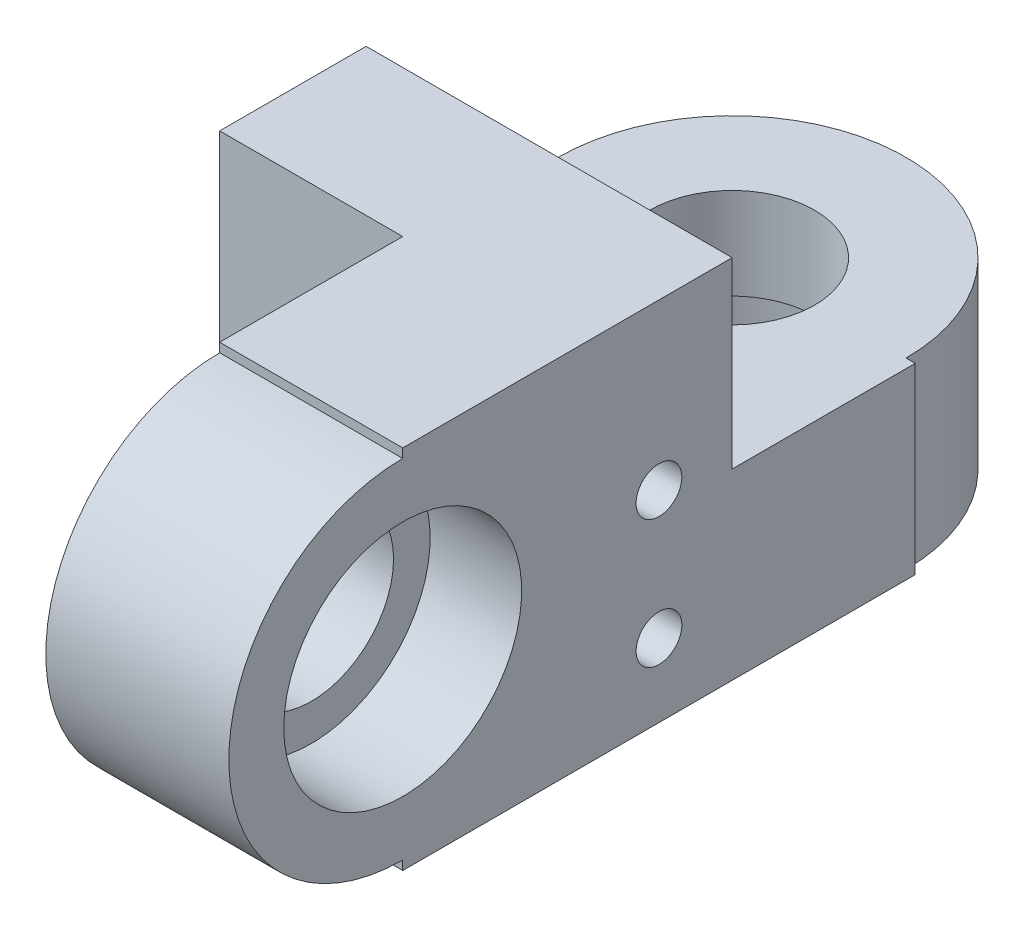
ISO-10303-21;
HEADER;
FILE_DESCRIPTION(('STEP AP214'),'2;1');
FILE_NAME('part.step','',(''),(''),'','','');
FILE_SCHEMA(('AUTOMOTIVE_DESIGN { 1 0 10303 214 1 1 1 1 }'));
ENDSEC;
DATA;
#1=APPLICATION_CONTEXT('core data for automotive mechanical design processes');
#2=APPLICATION_PROTOCOL_DEFINITION('international standard','automotive_design',2000,#1);
#3=PRODUCT_CONTEXT('',#1,'mechanical');
#4=PRODUCT('Part','Part','',(#3));
#5=PRODUCT_RELATED_PRODUCT_CATEGORY('part','',(#4));
#6=PRODUCT_DEFINITION_FORMATION('','',#4);
#7=PRODUCT_DEFINITION_CONTEXT('part definition',#1,'design');
#8=PRODUCT_DEFINITION('design','',#6,#7);
#9=PRODUCT_DEFINITION_SHAPE('','',#8);
#10=(LENGTH_UNIT() NAMED_UNIT(*) SI_UNIT(.MILLI.,.METRE.));
#11=(NAMED_UNIT(*) PLANE_ANGLE_UNIT() SI_UNIT($,.RADIAN.));
#12=(NAMED_UNIT(*) SI_UNIT($,.STERADIAN.) SOLID_ANGLE_UNIT());
#13=UNCERTAINTY_MEASURE_WITH_UNIT(LENGTH_MEASURE(1.E-05),#10,'distance_accuracy_value','');
#14=(GEOMETRIC_REPRESENTATION_CONTEXT(3) GLOBAL_UNCERTAINTY_ASSIGNED_CONTEXT((#13)) GLOBAL_UNIT_ASSIGNED_CONTEXT((#10,
#11,#12)) REPRESENTATION_CONTEXT('',''));
#15=CARTESIAN_POINT('',(0.,0.,0.));
#16=DIRECTION('',(0.,0.,1.));
#17=DIRECTION('',(1.,0.,0.));
#18=AXIS2_PLACEMENT_3D('',#15,#16,#17);
#19=CARTESIAN_POINT('',(10.,10.,50.5344121125077));
#20=DIRECTION('',(-1.,0.,0.));
#21=DIRECTION('',(0.,-1.,0.));
#22=AXIS2_PLACEMENT_3D('',#19,#20,#21);
#23=PLANE('',#22);
#24=CARTESIAN_POINT('',(10.,-5.99999999999996,25.2672060562539));
#25=DIRECTION('',(-1.,0.,0.));
#26=DIRECTION('',(0.,-1.,0.));
#27=AXIS2_PLACEMENT_3D('',#24,#25,#26);
#28=CIRCLE('',#27,1.25);
#29=CARTESIAN_POINT('',(10.,-7.24999999999996,25.2672060562539));
#30=VERTEX_POINT('',#29);
#31=EDGE_CURVE('E216',#30,#30,#28,.T.);
#32=ORIENTED_EDGE('',*,*,#31,.T.);
#33=EDGE_LOOP('',(#32));
#34=FACE_BOUND('',#33,.T.);
#35=CARTESIAN_POINT('',(10.,0.999999999999963,25.2672060562539));
#36=DIRECTION('',(-1.,0.,0.));
#37=DIRECTION('',(0.,-1.,0.));
#38=AXIS2_PLACEMENT_3D('',#35,#36,#37);
#39=CIRCLE('',#38,1.25);
#40=CARTESIAN_POINT('',(10.,-0.250000000000038,25.2672060562539));
#41=VERTEX_POINT('',#40);
#42=EDGE_CURVE('E406',#41,#41,#39,.T.);
#43=ORIENTED_EDGE('',*,*,#42,.T.);
#44=EDGE_LOOP('',(#43));
#45=FACE_BOUND('',#44,.T.);
#46=DIRECTION('',(0.,0.,-1.));
#47=VECTOR('',#46,1.);
#48=CARTESIAN_POINT('',(10.,-10.,50.5344121125077));
#49=LINE('',#48,#47);
#50=CARTESIAN_POINT('',(10.,-9.99999999999996,39.2672060562539));
#51=VERTEX_POINT('',#50);
#52=CARTESIAN_POINT('',(10.,-10.,11.2672060562539));
#53=VERTEX_POINT('',#52);
#54=EDGE_CURVE('E342',#51,#53,#49,.T.);
#55=ORIENTED_EDGE('',*,*,#54,.T.);
#56=DIRECTION('',(0.,1.,0.));
#57=VECTOR('',#56,1.);
#58=CARTESIAN_POINT('',(10.,10.,11.2672060562539));
#59=LINE('',#58,#57);
#60=CARTESIAN_POINT('',(10.,0.,11.2672060562539));
#61=VERTEX_POINT('',#60);
#62=EDGE_CURVE('E320',#53,#61,#59,.T.);
#63=ORIENTED_EDGE('',*,*,#62,.T.);
#64=DIRECTION('',(0.,0.,-1.));
#65=VECTOR('',#64,1.);
#66=CARTESIAN_POINT('',(10.,0.,0.));
#67=LINE('',#66,#65);
#68=CARTESIAN_POINT('',(10.,0.,21.2672060562539));
#69=VERTEX_POINT('',#68);
#70=EDGE_CURVE('E347',#69,#61,#67,.T.);
#71=ORIENTED_EDGE('',*,*,#70,.F.);
#72=DIRECTION('',(0.,-1.,0.));
#73=VECTOR('',#72,1.);
#74=CARTESIAN_POINT('',(10.,10.,21.2672060562539));
#75=LINE('',#74,#73);
#76=CARTESIAN_POINT('',(10.,10.,21.2672060562539));
#77=VERTEX_POINT('',#76);
#78=EDGE_CURVE('E321',#77,#69,#75,.T.);
#79=ORIENTED_EDGE('',*,*,#78,.F.);
#80=DIRECTION('',(0.,0.,-1.));
#81=VECTOR('',#80,1.);
#82=CARTESIAN_POINT('',(10.,10.,50.5344121125077));
#83=LINE('',#82,#81);
#84=CARTESIAN_POINT('',(9.99999999999997,10.,39.2672060562539));
#85=VERTEX_POINT('',#84);
#86=EDGE_CURVE('E336',#85,#77,#83,.T.);
#87=ORIENTED_EDGE('',*,*,#86,.F.);
#88=DIRECTION('',(0.,-1.,0.));
#89=VECTOR('',#88,1.);
#90=CARTESIAN_POINT('',(9.99999999999993,21.2621225064723,39.2672060562539));
#91=LINE('',#90,#89);
#92=CARTESIAN_POINT('',(9.99999999999997,9.50000000000003,39.2672060562539));
#93=VERTEX_POINT('',#92);
#94=EDGE_CURVE('E256',#85,#93,#91,.T.);
#95=ORIENTED_EDGE('',*,*,#94,.T.);
#96=CARTESIAN_POINT('',(10.,0.,39.2672060562539));
#97=DIRECTION('',(-1.,0.,0.));
#98=DIRECTION('',(0.,0.,1.));
#99=AXIS2_PLACEMENT_3D('',#96,#97,#98);
#100=CIRCLE('',#99,9.5);
#101=CARTESIAN_POINT('',(10.,-9.49999999999996,39.2672060562539));
#102=VERTEX_POINT('',#101);
#103=EDGE_CURVE('E248',#102,#93,#100,.T.);
#104=ORIENTED_EDGE('',*,*,#103,.F.);
#105=DIRECTION('',(0.,-1.,0.));
#106=VECTOR('',#105,1.);
#107=CARTESIAN_POINT('',(10.,-9.49999999999996,39.2672060562539));
#108=LINE('',#107,#106);
#109=EDGE_CURVE('E252',#102,#51,#108,.T.);
#110=ORIENTED_EDGE('',*,*,#109,.T.);
#111=EDGE_LOOP('',(#55,#63,#71,#79,#87,#95,#104,#110));
#112=FACE_BOUND('',#111,.T.);
#113=CARTESIAN_POINT('',(10.,0.,39.2672060562539));
#114=DIRECTION('',(-1.,0.,0.));
#115=DIRECTION('',(0.,0.,1.));
#116=AXIS2_PLACEMENT_3D('',#113,#114,#115);
#117=CIRCLE('',#116,6.5);
#118=CARTESIAN_POINT('',(10.,0.,45.7672060562539));
#119=VERTEX_POINT('',#118);
#120=EDGE_CURVE('E234',#119,#119,#117,.T.);
#121=ORIENTED_EDGE('',*,*,#120,.T.);
#122=EDGE_LOOP('',(#121));
#123=FACE_BOUND('',#122,.T.);
#124=ADVANCED_FACE('F69',(#34,#45,#112,#123),#23,.F.);
#125=CARTESIAN_POINT('',(-10.,10.,50.5344121125077));
#126=DIRECTION('',(1.,0.,0.));
#127=DIRECTION('',(0.,1.,0.));
#128=AXIS2_PLACEMENT_3D('',#125,#126,#127);
#129=PLANE('',#128);
#130=CARTESIAN_POINT('',(-9.99999999999999,-5.99999999999996,25.2672060562539));
#131=DIRECTION('',(1.,0.,0.));
#132=DIRECTION('',(0.,1.,0.));
#133=AXIS2_PLACEMENT_3D('',#130,#131,#132);
#134=CIRCLE('',#133,1.25);
#135=CARTESIAN_POINT('',(-9.99999999999999,-4.74999999999996,25.2672060562539));
#136=VERTEX_POINT('',#135);
#137=EDGE_CURVE('E415',#136,#136,#134,.T.);
#138=ORIENTED_EDGE('',*,*,#137,.T.);
#139=EDGE_LOOP('',(#138));
#140=FACE_BOUND('',#139,.T.);
#141=CARTESIAN_POINT('',(-9.99999999999999,0.999999999999963,25.2672060562539));
#142=DIRECTION('',(1.,0.,0.));
#143=DIRECTION('',(0.,1.,0.));
#144=AXIS2_PLACEMENT_3D('',#141,#142,#143);
#145=CIRCLE('',#144,1.25);
#146=CARTESIAN_POINT('',(-9.99999999999999,2.24999999999996,25.2672060562539));
#147=VERTEX_POINT('',#146);
#148=EDGE_CURVE('E400',#147,#147,#145,.T.);
#149=ORIENTED_EDGE('',*,*,#148,.T.);
#150=EDGE_LOOP('',(#149));
#151=FACE_BOUND('',#150,.T.);
#152=DIRECTION('',(0.,0.,-1.));
#153=VECTOR('',#152,1.);
#154=CARTESIAN_POINT('',(-10.,10.,50.5344121125077));
#155=LINE('',#154,#153);
#156=CARTESIAN_POINT('',(-10.,10.,29.2672060562539));
#157=VERTEX_POINT('',#156);
#158=CARTESIAN_POINT('',(-10.,10.,21.2672060562539));
#159=VERTEX_POINT('',#158);
#160=EDGE_CURVE('E385',#157,#159,#155,.T.);
#161=ORIENTED_EDGE('',*,*,#160,.T.);
#162=DIRECTION('',(0.,-1.,0.));
#163=VECTOR('',#162,1.);
#164=CARTESIAN_POINT('',(-10.,10.,21.2672060562539));
#165=LINE('',#164,#163);
#166=CARTESIAN_POINT('',(-10.,0.,21.2672060562539));
#167=VERTEX_POINT('',#166);
#168=EDGE_CURVE('E332',#159,#167,#165,.T.);
#169=ORIENTED_EDGE('',*,*,#168,.T.);
#170=DIRECTION('',(0.,0.,-1.));
#171=VECTOR('',#170,1.);
#172=CARTESIAN_POINT('',(-10.,0.,50.5344121125077));
#173=LINE('',#172,#171);
#174=CARTESIAN_POINT('',(-10.,0.,11.2672060562539));
#175=VERTEX_POINT('',#174);
#176=EDGE_CURVE('E337',#167,#175,#173,.T.);
#177=ORIENTED_EDGE('',*,*,#176,.T.);
#178=DIRECTION('',(0.,-1.,0.));
#179=VECTOR('',#178,1.);
#180=CARTESIAN_POINT('',(-10.,10.,11.2672060562539));
#181=LINE('',#180,#179);
#182=CARTESIAN_POINT('',(-10.,-10.,11.2672060562539));
#183=VERTEX_POINT('',#182);
#184=EDGE_CURVE('E359',#175,#183,#181,.T.);
#185=ORIENTED_EDGE('',*,*,#184,.T.);
#186=DIRECTION('',(0.,0.,-1.));
#187=VECTOR('',#186,1.);
#188=CARTESIAN_POINT('',(-10.,-10.,50.5344121125077));
#189=LINE('',#188,#187);
#190=CARTESIAN_POINT('',(-10.,-10.,29.2672060562539));
#191=VERTEX_POINT('',#190);
#192=EDGE_CURVE('E388',#191,#183,#189,.T.);
#193=ORIENTED_EDGE('',*,*,#192,.F.);
#194=DIRECTION('',(0.,-1.,0.));
#195=VECTOR('',#194,1.);
#196=CARTESIAN_POINT('',(-10.,-10.,29.2672060562539));
#197=LINE('',#196,#195);
#198=EDGE_CURVE('E305',#157,#191,#197,.T.);
#199=ORIENTED_EDGE('',*,*,#198,.F.);
#200=EDGE_LOOP('',(#161,#169,#177,#185,#193,#199));
#201=FACE_BOUND('',#200,.T.);
#202=ADVANCED_FACE('F442',(#140,#151,#201),#129,.F.);
#203=CARTESIAN_POINT('',(-10.,-10.,50.5344121125077));
#204=DIRECTION('',(0.,1.,0.));
#205=DIRECTION('',(0.,0.,1.));
#206=AXIS2_PLACEMENT_3D('',#203,#204,#205);
#207=PLANE('',#206);
#208=DIRECTION('',(-1.,0.,0.));
#209=VECTOR('',#208,1.);
#210=CARTESIAN_POINT('',(-7.,-10.,27.2672060562539));
#211=LINE('',#210,#209);
#212=CARTESIAN_POINT('',(7.,-10.,27.2672060562539));
#213=VERTEX_POINT('',#212);
#214=CARTESIAN_POINT('',(-7.,-10.,27.2672060562539));
#215=VERTEX_POINT('',#214);
#216=EDGE_CURVE('E225',#213,#215,#211,.T.);
#217=ORIENTED_EDGE('',*,*,#216,.F.);
#218=DIRECTION('',(0.,0.,1.));
#219=VECTOR('',#218,1.);
#220=CARTESIAN_POINT('',(7.,-10.,27.2672060562539));
#221=LINE('',#220,#219);
#222=CARTESIAN_POINT('',(7.,-10.,23.2672060562539));
#223=VERTEX_POINT('',#222);
#224=EDGE_CURVE('E87',#223,#213,#221,.T.);
#225=ORIENTED_EDGE('',*,*,#224,.F.);
#226=DIRECTION('',(1.,0.,0.));
#227=VECTOR('',#226,1.);
#228=CARTESIAN_POINT('',(-7.,-10.,23.2672060562539));
#229=LINE('',#228,#227);
#230=CARTESIAN_POINT('',(-7.,-10.,23.2672060562539));
#231=VERTEX_POINT('',#230);
#232=EDGE_CURVE('E209',#231,#223,#229,.T.);
#233=ORIENTED_EDGE('',*,*,#232,.F.);
#234=DIRECTION('',(0.,0.,-1.));
#235=VECTOR('',#234,1.);
#236=CARTESIAN_POINT('',(-7.,-10.,27.2672060562539));
#237=LINE('',#236,#235);
#238=EDGE_CURVE('E213',#215,#231,#237,.T.);
#239=ORIENTED_EDGE('',*,*,#238,.F.);
#240=EDGE_LOOP('',(#217,#225,#233,#239));
#241=FACE_BOUND('',#240,.T.);
#242=ORIENTED_EDGE('',*,*,#192,.T.);
#243=DIRECTION('',(-1.,0.,0.));
#244=VECTOR('',#243,1.);
#245=CARTESIAN_POINT('',(-9.5,-10.,11.2672060562539));
#246=LINE('',#245,#244);
#247=CARTESIAN_POINT('',(-9.5,-10.,11.2672060562539));
#248=VERTEX_POINT('',#247);
#249=EDGE_CURVE('E369',#248,#183,#246,.T.);
#250=ORIENTED_EDGE('',*,*,#249,.F.);
#251=CARTESIAN_POINT('',(0.,-10.,11.2672060562539));
#252=DIRECTION('',(0.,-1.,0.));
#253=DIRECTION('',(0.,0.,-1.));
#254=AXIS2_PLACEMENT_3D('',#251,#252,#253);
#255=CIRCLE('',#254,9.5);
#256=CARTESIAN_POINT('',(9.5,-10.,11.2672060562539));
#257=VERTEX_POINT('',#256);
#258=EDGE_CURVE('E315',#248,#257,#255,.T.);
#259=ORIENTED_EDGE('',*,*,#258,.T.);
#260=DIRECTION('',(-1.,0.,0.));
#261=VECTOR('',#260,1.);
#262=CARTESIAN_POINT('',(21.2621225064723,-10.,11.2672060562539));
#263=LINE('',#262,#261);
#264=EDGE_CURVE('E373',#53,#257,#263,.T.);
#265=ORIENTED_EDGE('',*,*,#264,.F.);
#266=ORIENTED_EDGE('',*,*,#54,.F.);
#267=DIRECTION('',(1.,0.,0.));
#268=VECTOR('',#267,1.);
#269=CARTESIAN_POINT('',(-9.99999999999996,-10.,39.2672060562539));
#270=LINE('',#269,#268);
#271=CARTESIAN_POINT('',(0.,-10.,39.2672060562539));
#272=VERTEX_POINT('',#271);
#273=EDGE_CURVE('E269',#272,#51,#270,.T.);
#274=ORIENTED_EDGE('',*,*,#273,.F.);
#275=DIRECTION('',(0.,0.,1.));
#276=VECTOR('',#275,1.);
#277=CARTESIAN_POINT('',(0.,-10.,50.5344121125077));
#278=LINE('',#277,#276);
#279=CARTESIAN_POINT('',(0.,-10.,29.2672060562539));
#280=VERTEX_POINT('',#279);
#281=EDGE_CURVE('E281',#280,#272,#278,.T.);
#282=ORIENTED_EDGE('',*,*,#281,.F.);
#283=DIRECTION('',(1.,0.,0.));
#284=VECTOR('',#283,1.);
#285=CARTESIAN_POINT('',(-10.,-10.,29.2672060562539));
#286=LINE('',#285,#284);
#287=EDGE_CURVE('E95',#191,#280,#286,.T.);
#288=ORIENTED_EDGE('',*,*,#287,.F.);
#289=EDGE_LOOP('',(#242,#250,#259,#265,#266,#274,#282,#288));
#290=FACE_BOUND('',#289,.T.);
#291=CARTESIAN_POINT('',(0.,-10.,11.2672060562539));
#292=DIRECTION('',(0.,-1.,0.));
#293=DIRECTION('',(0.,0.,-1.));
#294=AXIS2_PLACEMENT_3D('',#291,#292,#293);
#295=CIRCLE('',#294,6.5);
#296=CARTESIAN_POINT('',(0.,-10.,4.76720605625386));
#297=VERTEX_POINT('',#296);
#298=EDGE_CURVE('E13',#297,#297,#295,.T.);
#299=ORIENTED_EDGE('',*,*,#298,.F.);
#300=EDGE_LOOP('',(#299));
#301=FACE_BOUND('',#300,.T.);
#302=ADVANCED_FACE('F71',(#241,#290,#301),#207,.F.);
#303=CARTESIAN_POINT('',(-10.,10.,50.5344121125077));
#304=DIRECTION('',(0.,-1.,0.));
#305=DIRECTION('',(1.,0.,0.));
#306=AXIS2_PLACEMENT_3D('',#303,#304,#305);
#307=PLANE('',#306);
#308=ORIENTED_EDGE('',*,*,#86,.T.);
#309=DIRECTION('',(1.,0.,0.));
#310=VECTOR('',#309,1.);
#311=CARTESIAN_POINT('',(-24.,10.,21.2672060562539));
#312=LINE('',#311,#310);
#313=EDGE_CURVE('E343',#159,#77,#312,.T.);
#314=ORIENTED_EDGE('',*,*,#313,.F.);
#315=ORIENTED_EDGE('',*,*,#160,.F.);
#316=DIRECTION('',(-1.,0.,0.));
#317=VECTOR('',#316,1.);
#318=CARTESIAN_POINT('',(-10.,10.,29.2672060562539));
#319=LINE('',#318,#317);
#320=CARTESIAN_POINT('',(0.,10.,29.2672060562539));
#321=VERTEX_POINT('',#320);
#322=EDGE_CURVE('E296',#321,#157,#319,.T.);
#323=ORIENTED_EDGE('',*,*,#322,.F.);
#324=DIRECTION('',(0.,0.,1.));
#325=VECTOR('',#324,1.);
#326=CARTESIAN_POINT('',(0.,10.,50.5344121125077));
#327=LINE('',#326,#325);
#328=CARTESIAN_POINT('',(0.,10.,39.2672060562539));
#329=VERTEX_POINT('',#328);
#330=EDGE_CURVE('E274',#321,#329,#327,.T.);
#331=ORIENTED_EDGE('',*,*,#330,.T.);
#332=DIRECTION('',(-1.,0.,0.));
#333=VECTOR('',#332,1.);
#334=CARTESIAN_POINT('',(-10.,9.99999999999997,39.2672060562539));
#335=LINE('',#334,#333);
#336=EDGE_CURVE('E266',#85,#329,#335,.T.);
#337=ORIENTED_EDGE('',*,*,#336,.F.);
#338=EDGE_LOOP('',(#308,#314,#315,#323,#331,#337));
#339=FACE_BOUND('',#338,.T.);
#340=ADVANCED_FACE('F449',(#339),#307,.F.);
#341=CARTESIAN_POINT('',(0.,11.,11.2672060562539));
#342=DIRECTION('',(0.,-1.,0.));
#343=DIRECTION('',(0.,0.,-1.));
#344=AXIS2_PLACEMENT_3D('',#341,#342,#343);
#345=CYLINDRICAL_SURFACE('',#344,4.5);
#346=CARTESIAN_POINT('',(0.,0.,11.2672060562539));
#347=DIRECTION('',(0.,-1.,0.));
#348=DIRECTION('',(0.,0.,-1.));
#349=AXIS2_PLACEMENT_3D('',#346,#347,#348);
#350=CIRCLE('',#349,4.5);
#351=CARTESIAN_POINT('',(0.,0.,6.76720605625387));
#352=VERTEX_POINT('',#351);
#353=EDGE_CURVE('E316',#352,#352,#350,.T.);
#354=CARTESIAN_POINT('',(0.,-5.,11.2672060562539));
#355=DIRECTION('',(0.,-1.,0.));
#356=DIRECTION('',(0.,0.,-1.));
#357=AXIS2_PLACEMENT_3D('',#354,#355,#356);
#358=CIRCLE('',#357,4.5);
#359=CARTESIAN_POINT('',(0.,-5.,6.76720605625387));
#360=VERTEX_POINT('',#359);
#361=EDGE_CURVE('E311',#360,#360,#358,.F.);
#362=CARTESIAN_POINT('',(0.,0.,6.76720605625387));
#363=CARTESIAN_POINT('',(0.,-0.0520833333333334,6.76720605625387));
#364=CARTESIAN_POINT('',(0.,-0.104166666666667,6.76720605625387));
#365=CARTESIAN_POINT('',(0.,-0.208333333333334,6.76720605625387));
#366=CARTESIAN_POINT('',(0.,-0.260416666666667,6.76720605625387));
#367=CARTESIAN_POINT('',(0.,-0.364583333333334,6.76720605625387));
#368=CARTESIAN_POINT('',(0.,-0.416666666666667,6.76720605625387));
#369=CARTESIAN_POINT('',(0.,-0.520833333333334,6.76720605625387));
#370=CARTESIAN_POINT('',(0.,-0.572916666666667,6.76720605625387));
#371=CARTESIAN_POINT('',(0.,-0.677083333333333,6.76720605625387));
#372=CARTESIAN_POINT('',(0.,-0.729166666666666,6.76720605625387));
#373=CARTESIAN_POINT('',(0.,-0.833333333333332,6.76720605625387));
#374=CARTESIAN_POINT('',(0.,-0.885416666666666,6.76720605625387));
#375=CARTESIAN_POINT('',(0.,-0.989583333333333,6.76720605625387));
#376=CARTESIAN_POINT('',(0.,-1.04166666666667,6.76720605625387));
#377=CARTESIAN_POINT('',(0.,-1.14583333333333,6.76720605625387));
#378=CARTESIAN_POINT('',(0.,-1.19791666666667,6.76720605625387));
#379=CARTESIAN_POINT('',(0.,-1.30208333333333,6.76720605625387));
#380=CARTESIAN_POINT('',(0.,-1.35416666666667,6.76720605625387));
#381=CARTESIAN_POINT('',(0.,-1.45833333333333,6.76720605625387));
#382=CARTESIAN_POINT('',(0.,-1.51041666666667,6.76720605625387));
#383=CARTESIAN_POINT('',(0.,-1.61458333333333,6.76720605625387));
#384=CARTESIAN_POINT('',(0.,-1.66666666666667,6.76720605625387));
#385=CARTESIAN_POINT('',(0.,-1.77083333333333,6.76720605625387));
#386=CARTESIAN_POINT('',(0.,-1.82291666666667,6.76720605625387));
#387=CARTESIAN_POINT('',(0.,-1.92708333333333,6.76720605625387));
#388=CARTESIAN_POINT('',(0.,-1.97916666666667,6.76720605625387));
#389=CARTESIAN_POINT('',(0.,-2.08333333333333,6.76720605625387));
#390=CARTESIAN_POINT('',(0.,-2.13541666666667,6.76720605625387));
#391=CARTESIAN_POINT('',(0.,-2.23958333333333,6.76720605625387));
#392=CARTESIAN_POINT('',(0.,-2.29166666666667,6.76720605625387));
#393=CARTESIAN_POINT('',(0.,-2.39583333333333,6.76720605625387));
#394=CARTESIAN_POINT('',(0.,-2.44791666666667,6.76720605625387));
#395=CARTESIAN_POINT('',(0.,-2.55208333333333,6.76720605625387));
#396=CARTESIAN_POINT('',(0.,-2.60416666666667,6.76720605625387));
#397=CARTESIAN_POINT('',(0.,-2.70833333333333,6.76720605625387));
#398=CARTESIAN_POINT('',(0.,-2.76041666666667,6.76720605625387));
#399=CARTESIAN_POINT('',(0.,-2.86458333333333,6.76720605625387));
#400=CARTESIAN_POINT('',(0.,-2.91666666666667,6.76720605625387));
#401=CARTESIAN_POINT('',(0.,-3.02083333333333,6.76720605625387));
#402=CARTESIAN_POINT('',(0.,-3.07291666666667,6.76720605625387));
#403=CARTESIAN_POINT('',(0.,-3.17708333333333,6.76720605625387));
#404=CARTESIAN_POINT('',(0.,-3.22916666666667,6.76720605625387));
#405=CARTESIAN_POINT('',(0.,-3.33333333333333,6.76720605625387));
#406=CARTESIAN_POINT('',(0.,-3.38541666666667,6.76720605625387));
#407=CARTESIAN_POINT('',(0.,-3.48958333333333,6.76720605625387));
#408=CARTESIAN_POINT('',(0.,-3.54166666666666,6.76720605625387));
#409=CARTESIAN_POINT('',(0.,-3.64583333333333,6.76720605625387));
#410=CARTESIAN_POINT('',(0.,-3.69791666666666,6.76720605625387));
#411=CARTESIAN_POINT('',(0.,-3.80208333333333,6.76720605625387));
#412=CARTESIAN_POINT('',(0.,-3.85416666666667,6.76720605625387));
#413=CARTESIAN_POINT('',(0.,-3.95833333333333,6.76720605625387));
#414=CARTESIAN_POINT('',(0.,-4.01041666666666,6.76720605625387));
#415=CARTESIAN_POINT('',(0.,-4.11458333333333,6.76720605625387));
#416=CARTESIAN_POINT('',(0.,-4.16666666666666,6.76720605625387));
#417=CARTESIAN_POINT('',(0.,-4.27083333333333,6.76720605625387));
#418=CARTESIAN_POINT('',(0.,-4.32291666666666,6.76720605625387));
#419=CARTESIAN_POINT('',(0.,-4.42708333333333,6.76720605625387));
#420=CARTESIAN_POINT('',(0.,-4.47916666666666,6.76720605625387));
#421=CARTESIAN_POINT('',(0.,-4.58333333333333,6.76720605625387));
#422=CARTESIAN_POINT('',(0.,-4.63541666666666,6.76720605625387));
#423=CARTESIAN_POINT('',(0.,-4.73958333333333,6.76720605625387));
#424=CARTESIAN_POINT('',(0.,-4.79166666666666,6.76720605625387));
#425=CARTESIAN_POINT('',(0.,-4.89583333333333,6.76720605625387));
#426=CARTESIAN_POINT('',(0.,-4.94791666666666,6.76720605625387));
#427=CARTESIAN_POINT('',(0.,-5.,6.76720605625387));
#428=B_SPLINE_CURVE_WITH_KNOTS('',3,(#362,#363,#364,#365,#366,#367,#368,#369,#370,#371,#372,
#373,#374,#375,#376,#377,#378,#379,#380,#381,#382,#383,#384,#385,#386,#387,#388,#389,#390,#391,
#392,#393,#394,#395,#396,#397,#398,#399,#400,#401,#402,#403,#404,#405,#406,#407,#408,#409,#410,
#411,#412,#413,#414,#415,#416,#417,#418,#419,#420,#421,#422,#423,#424,#425,#426,#427),
.UNSPECIFIED.,.F.,.F.,(4,2,2,2,2,2,2,2,2,2,2,2,2,2,2,2,2,2,2,2,2,2,2,2,2,2,2,2,2,2,2,2,4),(0.,
0.15625,0.3125,0.46875,0.625000000000001,0.781249999999999,0.937499999999999,1.09375,1.25,
1.40625,1.5625,1.71875,1.875,2.03125,2.1875,2.34375,2.5,2.65625,2.8125,2.96875,3.125,3.28125,
3.4375,3.59375,3.75,3.90625,4.0625,4.21875,4.375,4.53125,4.6875,4.84375,5.),.UNSPECIFIED.);
#429=EDGE_CURVE('BSEAM451',#352,#360,#428,.T.);
#430=ORIENTED_EDGE('',*,*,#353,.F.);
#431=ORIENTED_EDGE('',*,*,#361,.F.);
#432=ORIENTED_EDGE('',*,*,#429,.T.);
#433=ORIENTED_EDGE('',*,*,#429,.F.);
#434=EDGE_LOOP('',(#430,#432,#431,#433));
#435=FACE_BOUND('',#434,.T.);
#436=ADVANCED_FACE('F451',(#435),#345,.F.);
#437=CARTESIAN_POINT('',(-24.,10.,21.2672060562539));
#438=DIRECTION('',(0.,0.,1.));
#439=DIRECTION('',(1.,0.,0.));
#440=AXIS2_PLACEMENT_3D('',#437,#438,#439);
#441=PLANE('',#440);
#442=ORIENTED_EDGE('',*,*,#313,.T.);
#443=ORIENTED_EDGE('',*,*,#78,.T.);
#444=DIRECTION('',(1.,0.,0.));
#445=VECTOR('',#444,1.);
#446=CARTESIAN_POINT('',(-24.,0.,21.2672060562539));
#447=LINE('',#446,#445);
#448=EDGE_CURVE('E341',#167,#69,#447,.T.);
#449=ORIENTED_EDGE('',*,*,#448,.F.);
#450=ORIENTED_EDGE('',*,*,#168,.F.);
#451=EDGE_LOOP('',(#442,#443,#449,#450));
#452=FACE_BOUND('',#451,.T.);
#453=ADVANCED_FACE('F457',(#452),#441,.F.);
#454=CARTESIAN_POINT('',(-24.,0.,0.));
#455=DIRECTION('',(0.,-1.,0.));
#456=DIRECTION('',(0.,0.,-1.));
#457=AXIS2_PLACEMENT_3D('',#454,#455,#456);
#458=PLANE('',#457);
#459=ORIENTED_EDGE('',*,*,#353,.T.);
#460=EDGE_LOOP('',(#459));
#461=FACE_BOUND('',#460,.T.);
#462=ORIENTED_EDGE('',*,*,#70,.T.);
#463=DIRECTION('',(-1.,0.,0.));
#464=VECTOR('',#463,1.);
#465=CARTESIAN_POINT('',(-24.,0.,11.2672060562539));
#466=LINE('',#465,#464);
#467=CARTESIAN_POINT('',(9.5,0.,11.2672060562539));
#468=VERTEX_POINT('',#467);
#469=EDGE_CURVE('E310',#61,#468,#466,.T.);
#470=ORIENTED_EDGE('',*,*,#469,.T.);
#471=CARTESIAN_POINT('',(0.,0.,11.2672060562539));
#472=DIRECTION('',(0.,-1.,0.));
#473=DIRECTION('',(0.,0.,-1.));
#474=AXIS2_PLACEMENT_3D('',#471,#472,#473);
#475=CIRCLE('',#474,9.5);
#476=CARTESIAN_POINT('',(-9.5,0.,11.2672060562539));
#477=VERTEX_POINT('',#476);
#478=EDGE_CURVE('E325',#477,#468,#475,.T.);
#479=ORIENTED_EDGE('',*,*,#478,.F.);
#480=DIRECTION('',(-1.,0.,0.));
#481=VECTOR('',#480,1.);
#482=CARTESIAN_POINT('',(-24.,0.,11.2672060562539));
#483=LINE('',#482,#481);
#484=EDGE_CURVE('E328',#477,#175,#483,.T.);
#485=ORIENTED_EDGE('',*,*,#484,.T.);
#486=ORIENTED_EDGE('',*,*,#176,.F.);
#487=ORIENTED_EDGE('',*,*,#448,.T.);
#488=EDGE_LOOP('',(#462,#470,#479,#485,#486,#487));
#489=FACE_BOUND('',#488,.T.);
#490=ADVANCED_FACE('F474',(#461,#489),#458,.F.);
#491=CARTESIAN_POINT('',(0.,11.,11.2672060562539));
#492=DIRECTION('',(0.,-1.,0.));
#493=DIRECTION('',(0.,0.,-1.));
#494=AXIS2_PLACEMENT_3D('',#491,#492,#493);
#495=CYLINDRICAL_SURFACE('',#494,9.5);
#496=ORIENTED_EDGE('',*,*,#478,.T.);
#497=DIRECTION('',(0.,-1.,0.));
#498=VECTOR('',#497,1.);
#499=CARTESIAN_POINT('',(9.5,11.,11.2672060562539));
#500=LINE('',#499,#498);
#501=EDGE_CURVE('E363',#468,#257,#500,.T.);
#502=ORIENTED_EDGE('',*,*,#501,.T.);
#503=ORIENTED_EDGE('',*,*,#258,.F.);
#504=DIRECTION('',(0.,-1.,0.));
#505=VECTOR('',#504,1.);
#506=CARTESIAN_POINT('',(-9.5,11.,11.2672060562539));
#507=LINE('',#506,#505);
#508=EDGE_CURVE('E366',#477,#248,#507,.T.);
#509=ORIENTED_EDGE('',*,*,#508,.F.);
#510=EDGE_LOOP('',(#496,#502,#503,#509));
#511=FACE_BOUND('',#510,.T.);
#512=ADVANCED_FACE('F505',(#511),#495,.T.);
#513=CARTESIAN_POINT('',(21.2621225064723,11.,11.2672060562539));
#514=DIRECTION('',(0.,0.,1.));
#515=DIRECTION('',(1.,0.,0.));
#516=AXIS2_PLACEMENT_3D('',#513,#514,#515);
#517=PLANE('',#516);
#518=ORIENTED_EDGE('',*,*,#264,.T.);
#519=ORIENTED_EDGE('',*,*,#501,.F.);
#520=ORIENTED_EDGE('',*,*,#469,.F.);
#521=ORIENTED_EDGE('',*,*,#62,.F.);
#522=EDGE_LOOP('',(#518,#519,#520,#521));
#523=FACE_BOUND('',#522,.T.);
#524=ADVANCED_FACE('F503',(#523),#517,.F.);
#525=CARTESIAN_POINT('',(-9.5,11.,11.2672060562539));
#526=DIRECTION('',(0.,0.,1.));
#527=DIRECTION('',(1.,0.,0.));
#528=AXIS2_PLACEMENT_3D('',#525,#526,#527);
#529=PLANE('',#528);
#530=ORIENTED_EDGE('',*,*,#484,.F.);
#531=ORIENTED_EDGE('',*,*,#508,.T.);
#532=ORIENTED_EDGE('',*,*,#249,.T.);
#533=ORIENTED_EDGE('',*,*,#184,.F.);
#534=EDGE_LOOP('',(#530,#531,#532,#533));
#535=FACE_BOUND('',#534,.T.);
#536=ADVANCED_FACE('F508',(#535),#529,.F.);
#537=CARTESIAN_POINT('',(0.,-5.,11.2672060562539));
#538=DIRECTION('',(0.,-1.,0.));
#539=DIRECTION('',(0.,0.,-1.));
#540=AXIS2_PLACEMENT_3D('',#537,#538,#539);
#541=PLANE('',#540);
#542=CARTESIAN_POINT('',(0.,-5.,11.2672060562539));
#543=DIRECTION('',(0.,-1.,0.));
#544=DIRECTION('',(0.,0.,-1.));
#545=AXIS2_PLACEMENT_3D('',#542,#543,#544);
#546=CIRCLE('',#545,6.5);
#547=CARTESIAN_POINT('',(0.,-5.,4.76720605625386));
#548=VERTEX_POINT('',#547);
#549=EDGE_CURVE('E79',#548,#548,#546,.T.);
#550=ORIENTED_EDGE('',*,*,#549,.T.);
#551=EDGE_LOOP('',(#550));
#552=FACE_BOUND('',#551,.T.);
#553=ORIENTED_EDGE('',*,*,#361,.T.);
#554=EDGE_LOOP('',(#553));
#555=FACE_BOUND('',#554,.T.);
#556=ADVANCED_FACE('F522',(#552,#555),#541,.T.);
#557=CARTESIAN_POINT('',(0.,-5.,11.2672060562539));
#558=DIRECTION('',(0.,-1.,0.));
#559=DIRECTION('',(0.,0.,-1.));
#560=AXIS2_PLACEMENT_3D('',#557,#558,#559);
#561=CYLINDRICAL_SURFACE('',#560,6.5);
#562=ORIENTED_EDGE('',*,*,#549,.F.);
#563=EDGE_LOOP('',(#562));
#564=FACE_BOUND('',#563,.T.);
#565=ORIENTED_EDGE('',*,*,#298,.T.);
#566=EDGE_LOOP('',(#565));
#567=FACE_BOUND('',#566,.T.);
#568=ADVANCED_FACE('F512',(#564,#567),#561,.F.);
#569=CARTESIAN_POINT('',(0.,0.,29.2672060562539));
#570=DIRECTION('',(0.,0.,-1.));
#571=DIRECTION('',(-1.,0.,0.));
#572=AXIS2_PLACEMENT_3D('',#569,#570,#571);
#573=PLANE('',#572);
#574=ORIENTED_EDGE('',*,*,#287,.T.);
#575=DIRECTION('',(0.,1.,0.));
#576=VECTOR('',#575,1.);
#577=CARTESIAN_POINT('',(0.,-24.,29.2672060562539));
#578=LINE('',#577,#576);
#579=EDGE_CURVE('E278',#280,#321,#578,.T.);
#580=ORIENTED_EDGE('',*,*,#579,.T.);
#581=ORIENTED_EDGE('',*,*,#322,.T.);
#582=ORIENTED_EDGE('',*,*,#198,.T.);
#583=EDGE_LOOP('',(#574,#580,#581,#582));
#584=FACE_BOUND('',#583,.T.);
#585=ADVANCED_FACE('F509',(#584),#573,.F.);
#586=CARTESIAN_POINT('',(-11.,0.,39.2672060562539));
#587=DIRECTION('',(1.,0.,0.));
#588=DIRECTION('',(0.,0.,-1.));
#589=AXIS2_PLACEMENT_3D('',#586,#587,#588);
#590=CYLINDRICAL_SURFACE('',#589,4.5);
#591=CARTESIAN_POINT('',(0.,0.,39.2672060562539));
#592=DIRECTION('',(-1.,0.,0.));
#593=DIRECTION('',(0.,0.,1.));
#594=AXIS2_PLACEMENT_3D('',#591,#592,#593);
#595=CIRCLE('',#594,4.5);
#596=CARTESIAN_POINT('',(0.,0.,34.7672060562539));
#597=VERTEX_POINT('',#596);
#598=EDGE_CURVE('E273',#597,#597,#595,.F.);
#599=CARTESIAN_POINT('',(5.,0.,39.2672060562539));
#600=DIRECTION('',(1.,0.,0.));
#601=DIRECTION('',(0.,0.,-1.));
#602=AXIS2_PLACEMENT_3D('',#599,#600,#601);
#603=CIRCLE('',#602,4.5);
#604=CARTESIAN_POINT('',(5.,0.,34.7672060562539));
#605=VERTEX_POINT('',#604);
#606=EDGE_CURVE('E244',#605,#605,#603,.T.);
#607=CARTESIAN_POINT('',(0.,0.,34.7672060562539));
#608=CARTESIAN_POINT('',(0.0520833333333368,0.,34.7672060562539));
#609=CARTESIAN_POINT('',(0.10416666666667,0.,34.7672060562539));
#610=CARTESIAN_POINT('',(0.208333333333337,0.,34.7672060562539));
#611=CARTESIAN_POINT('',(0.26041666666667,0.,34.7672060562539));
#612=CARTESIAN_POINT('',(0.364583333333337,0.,34.7672060562539));
#613=CARTESIAN_POINT('',(0.416666666666671,0.,34.7672060562539));
#614=CARTESIAN_POINT('',(0.520833333333337,0.,34.7672060562539));
#615=CARTESIAN_POINT('',(0.572916666666671,0.,34.7672060562539));
#616=CARTESIAN_POINT('',(0.677083333333337,0.,34.7672060562539));
#617=CARTESIAN_POINT('',(0.729166666666671,0.,34.7672060562539));
#618=CARTESIAN_POINT('',(0.833333333333337,0.,34.7672060562539));
#619=CARTESIAN_POINT('',(0.885416666666671,0.,34.7672060562539));
#620=CARTESIAN_POINT('',(0.989583333333338,0.,34.7672060562539));
#621=CARTESIAN_POINT('',(1.04166666666667,0.,34.7672060562539));
#622=CARTESIAN_POINT('',(1.14583333333334,0.,34.7672060562539));
#623=CARTESIAN_POINT('',(1.19791666666667,0.,34.7672060562539));
#624=CARTESIAN_POINT('',(1.30208333333334,0.,34.7672060562539));
#625=CARTESIAN_POINT('',(1.35416666666667,0.,34.7672060562539));
#626=CARTESIAN_POINT('',(1.45833333333334,0.,34.7672060562539));
#627=CARTESIAN_POINT('',(1.51041666666667,0.,34.7672060562539));
#628=CARTESIAN_POINT('',(1.61458333333334,0.,34.7672060562539));
#629=CARTESIAN_POINT('',(1.66666666666667,0.,34.7672060562539));
#630=CARTESIAN_POINT('',(1.77083333333334,0.,34.7672060562539));
#631=CARTESIAN_POINT('',(1.82291666666667,0.,34.7672060562539));
#632=CARTESIAN_POINT('',(1.92708333333334,0.,34.7672060562539));
#633=CARTESIAN_POINT('',(1.97916666666667,0.,34.7672060562539));
#634=CARTESIAN_POINT('',(2.08333333333334,0.,34.7672060562539));
#635=CARTESIAN_POINT('',(2.13541666666667,0.,34.7672060562539));
#636=CARTESIAN_POINT('',(2.23958333333334,0.,34.7672060562539));
#637=CARTESIAN_POINT('',(2.29166666666667,0.,34.7672060562539));
#638=CARTESIAN_POINT('',(2.39583333333334,0.,34.7672060562539));
#639=CARTESIAN_POINT('',(2.44791666666667,0.,34.7672060562539));
#640=CARTESIAN_POINT('',(2.55208333333334,0.,34.7672060562539));
#641=CARTESIAN_POINT('',(2.60416666666667,0.,34.7672060562539));
#642=CARTESIAN_POINT('',(2.70833333333334,0.,34.7672060562539));
#643=CARTESIAN_POINT('',(2.76041666666667,0.,34.7672060562539));
#644=CARTESIAN_POINT('',(2.86458333333334,0.,34.7672060562539));
#645=CARTESIAN_POINT('',(2.91666666666667,0.,34.7672060562539));
#646=CARTESIAN_POINT('',(3.02083333333334,0.,34.7672060562539));
#647=CARTESIAN_POINT('',(3.07291666666667,0.,34.7672060562539));
#648=CARTESIAN_POINT('',(3.17708333333334,0.,34.7672060562539));
#649=CARTESIAN_POINT('',(3.22916666666667,0.,34.7672060562539));
#650=CARTESIAN_POINT('',(3.33333333333334,0.,34.7672060562539));
#651=CARTESIAN_POINT('',(3.38541666666667,0.,34.7672060562539));
#652=CARTESIAN_POINT('',(3.48958333333334,0.,34.7672060562539));
#653=CARTESIAN_POINT('',(3.54166666666667,0.,34.7672060562539));
#654=CARTESIAN_POINT('',(3.64583333333334,0.,34.7672060562539));
#655=CARTESIAN_POINT('',(3.69791666666667,0.,34.7672060562539));
#656=CARTESIAN_POINT('',(3.80208333333334,0.,34.7672060562539));
#657=CARTESIAN_POINT('',(3.85416666666667,0.,34.7672060562539));
#658=CARTESIAN_POINT('',(3.95833333333334,0.,34.7672060562539));
#659=CARTESIAN_POINT('',(4.01041666666667,0.,34.7672060562539));
#660=CARTESIAN_POINT('',(4.11458333333334,0.,34.7672060562539));
#661=CARTESIAN_POINT('',(4.16666666666667,0.,34.7672060562539));
#662=CARTESIAN_POINT('',(4.27083333333334,0.,34.7672060562539));
#663=CARTESIAN_POINT('',(4.32291666666667,0.,34.7672060562539));
#664=CARTESIAN_POINT('',(4.42708333333334,0.,34.7672060562539));
#665=CARTESIAN_POINT('',(4.47916666666667,0.,34.7672060562539));
#666=CARTESIAN_POINT('',(4.58333333333334,0.,34.7672060562539));
#667=CARTESIAN_POINT('',(4.63541666666667,0.,34.7672060562539));
#668=CARTESIAN_POINT('',(4.73958333333334,0.,34.7672060562539));
#669=CARTESIAN_POINT('',(4.79166666666667,0.,34.7672060562539));
#670=CARTESIAN_POINT('',(4.89583333333334,0.,34.7672060562539));
#671=CARTESIAN_POINT('',(4.94791666666667,0.,34.7672060562539));
#672=CARTESIAN_POINT('',(5.,0.,34.7672060562539));
#673=B_SPLINE_CURVE_WITH_KNOTS('',3,(#607,#608,#609,#610,#611,#612,#613,#614,#615,#616,#617,
#618,#619,#620,#621,#622,#623,#624,#625,#626,#627,#628,#629,#630,#631,#632,#633,#634,#635,#636,
#637,#638,#639,#640,#641,#642,#643,#644,#645,#646,#647,#648,#649,#650,#651,#652,#653,#654,#655,
#656,#657,#658,#659,#660,#661,#662,#663,#664,#665,#666,#667,#668,#669,#670,#671,#672),
.UNSPECIFIED.,.F.,.F.,(4,2,2,2,2,2,2,2,2,2,2,2,2,2,2,2,2,2,2,2,2,2,2,2,2,2,2,2,2,2,2,2,4),(0.,
0.15625,0.3125,0.46875,0.625000000000001,0.781250000000001,0.937500000000001,1.09375,1.25,
1.40625,1.5625,1.71875,1.875,2.03125,2.1875,2.34375,2.5,2.65625,2.8125,2.96875,3.125,3.28125,
3.4375,3.59375,3.75,3.90625,4.0625,4.21875,4.375,4.53125,4.6875,4.84375,5.),.UNSPECIFIED.);
#674=EDGE_CURVE('BSEAM511',#597,#605,#673,.T.);
#675=ORIENTED_EDGE('',*,*,#598,.F.);
#676=ORIENTED_EDGE('',*,*,#606,.T.);
#677=ORIENTED_EDGE('',*,*,#674,.T.);
#678=ORIENTED_EDGE('',*,*,#674,.F.);
#679=EDGE_LOOP('',(#675,#677,#676,#678));
#680=FACE_BOUND('',#679,.T.);
#681=ADVANCED_FACE('F511',(#680),#590,.F.);
#682=CARTESIAN_POINT('',(5.,0.,39.2672060562539));
#683=DIRECTION('',(1.,0.,0.));
#684=DIRECTION('',(0.,0.,1.));
#685=AXIS2_PLACEMENT_3D('',#682,#683,#684);
#686=PLANE('',#685);
#687=ORIENTED_EDGE('',*,*,#606,.F.);
#688=EDGE_LOOP('',(#687));
#689=FACE_BOUND('',#688,.T.);
#690=CARTESIAN_POINT('',(5.,0.,39.2672060562539));
#691=DIRECTION('',(-1.,0.,0.));
#692=DIRECTION('',(0.,0.,1.));
#693=AXIS2_PLACEMENT_3D('',#690,#691,#692);
#694=CIRCLE('',#693,6.5);
#695=CARTESIAN_POINT('',(5.,0.,45.7672060562539));
#696=VERTEX_POINT('',#695);
#697=EDGE_CURVE('E240',#696,#696,#694,.T.);
#698=ORIENTED_EDGE('',*,*,#697,.F.);
#699=EDGE_LOOP('',(#698));
#700=FACE_BOUND('',#699,.T.);
#701=ADVANCED_FACE('F519',(#689,#700),#686,.T.);
#702=CARTESIAN_POINT('',(0.,-24.,50.5344121125077));
#703=DIRECTION('',(-1.,0.,0.));
#704=DIRECTION('',(0.,0.,1.));
#705=AXIS2_PLACEMENT_3D('',#702,#703,#704);
#706=PLANE('',#705);
#707=ORIENTED_EDGE('',*,*,#281,.T.);
#708=DIRECTION('',(0.,1.,0.));
#709=VECTOR('',#708,1.);
#710=CARTESIAN_POINT('',(0.,-24.,39.2672060562539));
#711=LINE('',#710,#709);
#712=CARTESIAN_POINT('',(0.,-9.5,39.2672060562539));
#713=VERTEX_POINT('',#712);
#714=EDGE_CURVE('E292',#272,#713,#711,.T.);
#715=ORIENTED_EDGE('',*,*,#714,.T.);
#716=CARTESIAN_POINT('',(0.,0.,39.2672060562539));
#717=DIRECTION('',(-1.,0.,0.));
#718=DIRECTION('',(0.,0.,1.));
#719=AXIS2_PLACEMENT_3D('',#716,#717,#718);
#720=CIRCLE('',#719,9.5);
#721=CARTESIAN_POINT('',(0.,9.5,39.2672060562539));
#722=VERTEX_POINT('',#721);
#723=EDGE_CURVE('E289',#722,#713,#720,.F.);
#724=ORIENTED_EDGE('',*,*,#723,.F.);
#725=DIRECTION('',(0.,1.,0.));
#726=VECTOR('',#725,1.);
#727=CARTESIAN_POINT('',(0.,-24.,39.2672060562539));
#728=LINE('',#727,#726);
#729=EDGE_CURVE('E285',#722,#329,#728,.T.);
#730=ORIENTED_EDGE('',*,*,#729,.T.);
#731=ORIENTED_EDGE('',*,*,#330,.F.);
#732=ORIENTED_EDGE('',*,*,#579,.F.);
#733=EDGE_LOOP('',(#707,#715,#724,#730,#731,#732));
#734=FACE_BOUND('',#733,.T.);
#735=ORIENTED_EDGE('',*,*,#598,.T.);
#736=EDGE_LOOP('',(#735));
#737=FACE_BOUND('',#736,.T.);
#738=ADVANCED_FACE('F481',(#734,#737),#706,.T.);
#739=CARTESIAN_POINT('',(-11.,-9.50000000000004,39.2672060562539));
#740=DIRECTION('',(0.,0.,1.));
#741=DIRECTION('',(0.,1.,0.));
#742=AXIS2_PLACEMENT_3D('',#739,#740,#741);
#743=PLANE('',#742);
#744=ORIENTED_EDGE('',*,*,#273,.T.);
#745=ORIENTED_EDGE('',*,*,#109,.F.);
#746=DIRECTION('',(1.,0.,0.));
#747=VECTOR('',#746,1.);
#748=CARTESIAN_POINT('',(-11.,-9.50000000000004,39.2672060562539));
#749=LINE('',#748,#747);
#750=EDGE_CURVE('E263',#713,#102,#749,.T.);
#751=ORIENTED_EDGE('',*,*,#750,.F.);
#752=ORIENTED_EDGE('',*,*,#714,.F.);
#753=EDGE_LOOP('',(#744,#745,#751,#752));
#754=FACE_BOUND('',#753,.T.);
#755=ADVANCED_FACE('F494',(#754),#743,.T.);
#756=CARTESIAN_POINT('',(-11.,0.,39.2672060562539));
#757=DIRECTION('',(1.,0.,0.));
#758=DIRECTION('',(0.,0.,-1.));
#759=AXIS2_PLACEMENT_3D('',#756,#757,#758);
#760=CYLINDRICAL_SURFACE('',#759,9.5);
#761=ORIENTED_EDGE('',*,*,#723,.T.);
#762=ORIENTED_EDGE('',*,*,#750,.T.);
#763=ORIENTED_EDGE('',*,*,#103,.T.);
#764=DIRECTION('',(1.,0.,0.));
#765=VECTOR('',#764,1.);
#766=CARTESIAN_POINT('',(-11.,9.49999999999996,39.2672060562539));
#767=LINE('',#766,#765);
#768=EDGE_CURVE('E260',#722,#93,#767,.T.);
#769=ORIENTED_EDGE('',*,*,#768,.F.);
#770=EDGE_LOOP('',(#761,#762,#763,#769));
#771=FACE_BOUND('',#770,.T.);
#772=ADVANCED_FACE('F489',(#771),#760,.T.);
#773=CARTESIAN_POINT('',(-11.0000000000001,21.2621225064723,39.2672060562539));
#774=DIRECTION('',(0.,0.,1.));
#775=DIRECTION('',(0.,1.,0.));
#776=AXIS2_PLACEMENT_3D('',#773,#774,#775);
#777=PLANE('',#776);
#778=ORIENTED_EDGE('',*,*,#336,.T.);
#779=ORIENTED_EDGE('',*,*,#729,.F.);
#780=ORIENTED_EDGE('',*,*,#768,.T.);
#781=ORIENTED_EDGE('',*,*,#94,.F.);
#782=EDGE_LOOP('',(#778,#779,#780,#781));
#783=FACE_BOUND('',#782,.T.);
#784=ADVANCED_FACE('F487',(#783),#777,.T.);
#785=CARTESIAN_POINT('',(5.,0.,39.2672060562539));
#786=DIRECTION('',(1.,0.,0.));
#787=DIRECTION('',(0.,0.,-1.));
#788=AXIS2_PLACEMENT_3D('',#785,#786,#787);
#789=CYLINDRICAL_SURFACE('',#788,6.5);
#790=ORIENTED_EDGE('',*,*,#697,.T.);
#791=EDGE_LOOP('',(#790));
#792=FACE_BOUND('',#791,.T.);
#793=ORIENTED_EDGE('',*,*,#120,.F.);
#794=EDGE_LOOP('',(#793));
#795=FACE_BOUND('',#794,.T.);
#796=ADVANCED_FACE('F514',(#792,#795),#789,.F.);
#797=CARTESIAN_POINT('',(7.,5.,27.2672060562539));
#798=DIRECTION('',(1.,0.,0.));
#799=DIRECTION('',(0.,0.,-1.));
#800=AXIS2_PLACEMENT_3D('',#797,#798,#799);
#801=PLANE('',#800);
#802=CARTESIAN_POINT('',(7.,-5.99999999999996,25.2672060562539));
#803=DIRECTION('',(1.,0.,0.));
#804=DIRECTION('',(0.,0.,-1.));
#805=AXIS2_PLACEMENT_3D('',#802,#803,#804);
#806=CIRCLE('',#805,1.25);
#807=CARTESIAN_POINT('',(7.,-5.99999999999996,24.0172060562539));
#808=VERTEX_POINT('',#807);
#809=EDGE_CURVE('E412',#808,#808,#806,.T.);
#810=ORIENTED_EDGE('',*,*,#809,.T.);
#811=EDGE_LOOP('',(#810));
#812=FACE_BOUND('',#811,.T.);
#813=CARTESIAN_POINT('',(7.,0.999999999999963,25.2672060562539));
#814=DIRECTION('',(1.,0.,0.));
#815=DIRECTION('',(0.,0.,-1.));
#816=AXIS2_PLACEMENT_3D('',#813,#814,#815);
#817=CIRCLE('',#816,1.25);
#818=CARTESIAN_POINT('',(7.,0.999999999999963,24.0172060562539));
#819=VERTEX_POINT('',#818);
#820=EDGE_CURVE('E395',#819,#819,#817,.T.);
#821=ORIENTED_EDGE('',*,*,#820,.T.);
#822=EDGE_LOOP('',(#821));
#823=FACE_BOUND('',#822,.T.);
#824=ORIENTED_EDGE('',*,*,#224,.T.);
#825=DIRECTION('',(0.,-1.,0.));
#826=VECTOR('',#825,1.);
#827=CARTESIAN_POINT('',(7.,5.,27.2672060562539));
#828=LINE('',#827,#826);
#829=CARTESIAN_POINT('',(7.,5.,27.2672060562539));
#830=VERTEX_POINT('',#829);
#831=EDGE_CURVE('E184',#830,#213,#828,.T.);
#832=ORIENTED_EDGE('',*,*,#831,.F.);
#833=DIRECTION('',(0.,0.,1.));
#834=VECTOR('',#833,1.);
#835=CARTESIAN_POINT('',(7.,5.,27.2672060562539));
#836=LINE('',#835,#834);
#837=CARTESIAN_POINT('',(7.,5.,23.2672060562539));
#838=VERTEX_POINT('',#837);
#839=EDGE_CURVE('E188',#838,#830,#836,.T.);
#840=ORIENTED_EDGE('',*,*,#839,.F.);
#841=DIRECTION('',(0.,-1.,0.));
#842=VECTOR('',#841,1.);
#843=CARTESIAN_POINT('',(7.,5.,23.2672060562539));
#844=LINE('',#843,#842);
#845=EDGE_CURVE('E231',#838,#223,#844,.T.);
#846=ORIENTED_EDGE('',*,*,#845,.T.);
#847=EDGE_LOOP('',(#824,#832,#840,#846));
#848=FACE_BOUND('',#847,.T.);
#849=ADVANCED_FACE('F186',(#812,#823,#848),#801,.F.);
#850=CARTESIAN_POINT('',(-7.,5.,23.2672060562539));
#851=DIRECTION('',(0.,0.,-1.));
#852=DIRECTION('',(-1.,0.,0.));
#853=AXIS2_PLACEMENT_3D('',#850,#851,#852);
#854=PLANE('',#853);
#855=ORIENTED_EDGE('',*,*,#232,.T.);
#856=ORIENTED_EDGE('',*,*,#845,.F.);
#857=DIRECTION('',(1.,0.,0.));
#858=VECTOR('',#857,1.);
#859=CARTESIAN_POINT('',(-7.,5.,23.2672060562539));
#860=LINE('',#859,#858);
#861=CARTESIAN_POINT('',(-7.,5.,23.2672060562539));
#862=VERTEX_POINT('',#861);
#863=EDGE_CURVE('E195',#862,#838,#860,.T.);
#864=ORIENTED_EDGE('',*,*,#863,.F.);
#865=DIRECTION('',(0.,-1.,0.));
#866=VECTOR('',#865,1.);
#867=CARTESIAN_POINT('',(-7.,5.,23.2672060562539));
#868=LINE('',#867,#866);
#869=EDGE_CURVE('E235',#862,#231,#868,.T.);
#870=ORIENTED_EDGE('',*,*,#869,.T.);
#871=EDGE_LOOP('',(#855,#856,#864,#870));
#872=FACE_BOUND('',#871,.T.);
#873=ADVANCED_FACE('F534',(#872),#854,.F.);
#874=CARTESIAN_POINT('',(-7.,5.,27.2672060562539));
#875=DIRECTION('',(-1.,0.,0.));
#876=DIRECTION('',(0.,0.,1.));
#877=AXIS2_PLACEMENT_3D('',#874,#875,#876);
#878=PLANE('',#877);
#879=CARTESIAN_POINT('',(-6.99999999999999,-5.99999999999996,25.2672060562539));
#880=DIRECTION('',(-1.,0.,0.));
#881=DIRECTION('',(0.,0.,1.));
#882=AXIS2_PLACEMENT_3D('',#879,#880,#881);
#883=CIRCLE('',#882,1.25);
#884=CARTESIAN_POINT('',(-6.99999999999999,-5.99999999999996,26.5172060562539));
#885=VERTEX_POINT('',#884);
#886=EDGE_CURVE('E73',#885,#885,#883,.T.);
#887=ORIENTED_EDGE('',*,*,#886,.T.);
#888=EDGE_LOOP('',(#887));
#889=FACE_BOUND('',#888,.T.);
#890=CARTESIAN_POINT('',(-6.99999999999999,0.999999999999963,25.2672060562539));
#891=DIRECTION('',(-1.,0.,0.));
#892=DIRECTION('',(0.,0.,1.));
#893=AXIS2_PLACEMENT_3D('',#890,#891,#892);
#894=CIRCLE('',#893,1.25);
#895=CARTESIAN_POINT('',(-6.99999999999999,0.999999999999963,26.5172060562539));
#896=VERTEX_POINT('',#895);
#897=EDGE_CURVE('E392',#896,#896,#894,.T.);
#898=ORIENTED_EDGE('',*,*,#897,.T.);
#899=EDGE_LOOP('',(#898));
#900=FACE_BOUND('',#899,.T.);
#901=ORIENTED_EDGE('',*,*,#238,.T.);
#902=ORIENTED_EDGE('',*,*,#869,.F.);
#903=DIRECTION('',(0.,0.,-1.));
#904=VECTOR('',#903,1.);
#905=CARTESIAN_POINT('',(-7.,5.,27.2672060562539));
#906=LINE('',#905,#904);
#907=CARTESIAN_POINT('',(-7.,5.,27.2672060562539));
#908=VERTEX_POINT('',#907);
#909=EDGE_CURVE('E204',#908,#862,#906,.T.);
#910=ORIENTED_EDGE('',*,*,#909,.F.);
#911=DIRECTION('',(0.,-1.,0.));
#912=VECTOR('',#911,1.);
#913=CARTESIAN_POINT('',(-7.,5.,27.2672060562539));
#914=LINE('',#913,#912);
#915=EDGE_CURVE('E194',#908,#215,#914,.T.);
#916=ORIENTED_EDGE('',*,*,#915,.T.);
#917=EDGE_LOOP('',(#901,#902,#910,#916));
#918=FACE_BOUND('',#917,.T.);
#919=ADVANCED_FACE('F681',(#889,#900,#918),#878,.F.);
#920=CARTESIAN_POINT('',(-7.,5.,27.2672060562539));
#921=DIRECTION('',(0.,0.,1.));
#922=DIRECTION('',(1.,0.,0.));
#923=AXIS2_PLACEMENT_3D('',#920,#921,#922);
#924=PLANE('',#923);
#925=ORIENTED_EDGE('',*,*,#216,.T.);
#926=ORIENTED_EDGE('',*,*,#915,.F.);
#927=DIRECTION('',(-1.,0.,0.));
#928=VECTOR('',#927,1.);
#929=CARTESIAN_POINT('',(-7.,5.,27.2672060562539));
#930=LINE('',#929,#928);
#931=EDGE_CURVE('E198',#830,#908,#930,.T.);
#932=ORIENTED_EDGE('',*,*,#931,.F.);
#933=ORIENTED_EDGE('',*,*,#831,.T.);
#934=EDGE_LOOP('',(#925,#926,#932,#933));
#935=FACE_BOUND('',#934,.T.);
#936=ADVANCED_FACE('F199',(#935),#924,.F.);
#937=CARTESIAN_POINT('',(0.,5.,0.));
#938=DIRECTION('',(0.,-1.,0.));
#939=DIRECTION('',(0.,0.,-1.));
#940=AXIS2_PLACEMENT_3D('',#937,#938,#939);
#941=PLANE('',#940);
#942=ORIENTED_EDGE('',*,*,#839,.T.);
#943=ORIENTED_EDGE('',*,*,#931,.T.);
#944=ORIENTED_EDGE('',*,*,#909,.T.);
#945=ORIENTED_EDGE('',*,*,#863,.T.);
#946=EDGE_LOOP('',(#942,#943,#944,#945));
#947=FACE_BOUND('',#946,.T.);
#948=ADVANCED_FACE('F206',(#947),#941,.T.);
#949=CARTESIAN_POINT('',(56.,0.999999999999963,25.2672060562539));
#950=DIRECTION('',(-1.,0.,0.));
#951=DIRECTION('',(0.,0.,1.));
#952=AXIS2_PLACEMENT_3D('',#949,#950,#951);
#953=CYLINDRICAL_SURFACE('',#952,1.25);
#954=ORIENTED_EDGE('',*,*,#897,.F.);
#955=EDGE_LOOP('',(#954));
#956=FACE_BOUND('',#955,.T.);
#957=ORIENTED_EDGE('',*,*,#148,.F.);
#958=EDGE_LOOP('',(#957));
#959=FACE_BOUND('',#958,.T.);
#960=ADVANCED_FACE('F437',(#956,#959),#953,.F.);
#961=CARTESIAN_POINT('',(56.,-5.99999999999996,25.2672060562539));
#962=DIRECTION('',(-1.,0.,0.));
#963=DIRECTION('',(0.,0.,1.));
#964=AXIS2_PLACEMENT_3D('',#961,#962,#963);
#965=CYLINDRICAL_SURFACE('',#964,1.25);
#966=ORIENTED_EDGE('',*,*,#886,.F.);
#967=EDGE_LOOP('',(#966));
#968=FACE_BOUND('',#967,.T.);
#969=ORIENTED_EDGE('',*,*,#137,.F.);
#970=EDGE_LOOP('',(#969));
#971=FACE_BOUND('',#970,.T.);
#972=ADVANCED_FACE('F431',(#968,#971),#965,.F.);
#973=ORIENTED_EDGE('',*,*,#820,.F.);
#974=EDGE_LOOP('',(#973));
#975=FACE_BOUND('',#974,.T.);
#976=ORIENTED_EDGE('',*,*,#42,.F.);
#977=EDGE_LOOP('',(#976));
#978=FACE_BOUND('',#977,.T.);
#979=ADVANCED_FACE('F428',(#975,#978),#953,.F.);
#980=ORIENTED_EDGE('',*,*,#809,.F.);
#981=EDGE_LOOP('',(#980));
#982=FACE_BOUND('',#981,.T.);
#983=ORIENTED_EDGE('',*,*,#31,.F.);
#984=EDGE_LOOP('',(#983));
#985=FACE_BOUND('',#984,.T.);
#986=ADVANCED_FACE('F426',(#982,#985),#965,.F.);
#987=CLOSED_SHELL('',(#124,#202,#302,#340,#436,#453,#490,#512,#524,#536,#556,#568,#585,#681,
#701,#738,#755,#772,#784,#796,#849,#873,#919,#936,#948,#960,#972,#979,#986));
#988=MANIFOLD_SOLID_BREP('B2',#987);
#989=ADVANCED_BREP_SHAPE_REPRESENTATION('',(#18,#988),#14);
#990=SHAPE_DEFINITION_REPRESENTATION(#9,#989);
ENDSEC;
END-ISO-10303-21;
